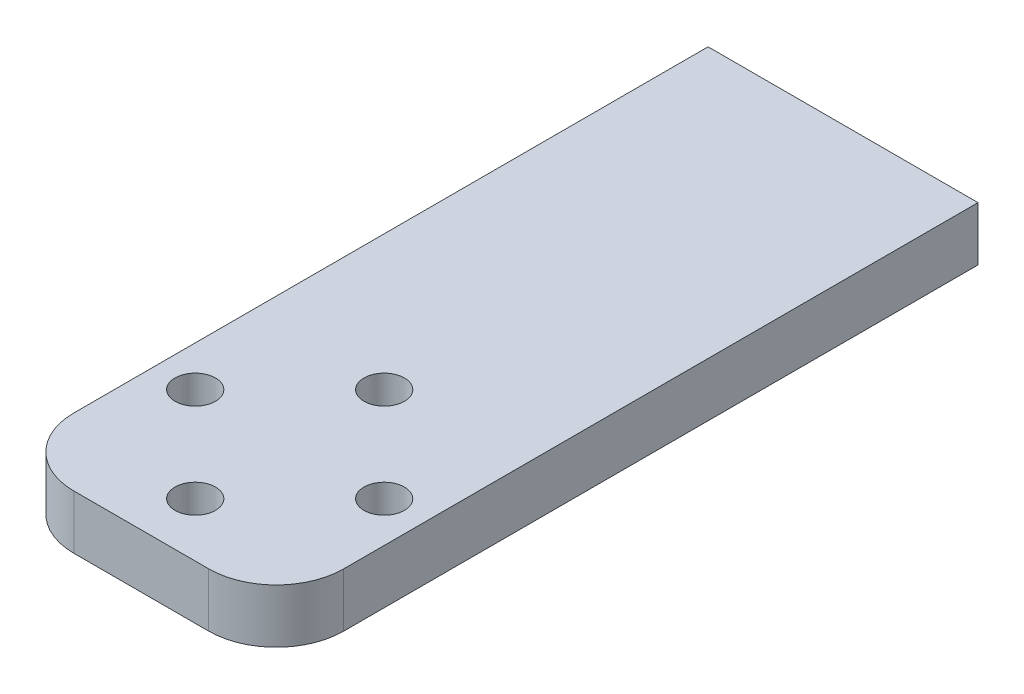
ISO-10303-21;
HEADER;
FILE_DESCRIPTION(('STEP AP214'),'2;1');
FILE_NAME('part.step','',(''),(''),'','','');
FILE_SCHEMA(('AUTOMOTIVE_DESIGN { 1 0 10303 214 1 1 1 1 }'));
ENDSEC;
DATA;
#1=APPLICATION_CONTEXT('core data for automotive mechanical design processes');
#2=APPLICATION_PROTOCOL_DEFINITION('international standard','automotive_design',2000,#1);
#3=PRODUCT_CONTEXT('',#1,'mechanical');
#4=PRODUCT('Part','Part','',(#3));
#5=PRODUCT_RELATED_PRODUCT_CATEGORY('part','',(#4));
#6=PRODUCT_DEFINITION_FORMATION('','',#4);
#7=PRODUCT_DEFINITION_CONTEXT('part definition',#1,'design');
#8=PRODUCT_DEFINITION('design','',#6,#7);
#9=PRODUCT_DEFINITION_SHAPE('','',#8);
#10=(LENGTH_UNIT() NAMED_UNIT(*) SI_UNIT(.MILLI.,.METRE.));
#11=(NAMED_UNIT(*) PLANE_ANGLE_UNIT() SI_UNIT($,.RADIAN.));
#12=(NAMED_UNIT(*) SI_UNIT($,.STERADIAN.) SOLID_ANGLE_UNIT());
#13=UNCERTAINTY_MEASURE_WITH_UNIT(LENGTH_MEASURE(1.E-05),#10,'distance_accuracy_value','');
#14=(GEOMETRIC_REPRESENTATION_CONTEXT(3) GLOBAL_UNCERTAINTY_ASSIGNED_CONTEXT((#13)) GLOBAL_UNIT_ASSIGNED_CONTEXT((#10,
#11,#12)) REPRESENTATION_CONTEXT('',''));
#15=CARTESIAN_POINT('',(0.,0.,0.));
#16=DIRECTION('',(0.,0.,1.));
#17=DIRECTION('',(1.,0.,0.));
#18=AXIS2_PLACEMENT_3D('',#15,#16,#17);
#19=CARTESIAN_POINT('',(0.,4.,0.));
#20=DIRECTION('',(0.,1.,0.));
#21=DIRECTION('',(0.,0.,1.));
#22=AXIS2_PLACEMENT_3D('',#19,#20,#21);
#23=PLANE('',#22);
#24=CARTESIAN_POINT('',(7.,4.,15.));
#25=DIRECTION('',(0.,1.,0.));
#26=DIRECTION('',(0.,0.,1.));
#27=AXIS2_PLACEMENT_3D('',#24,#25,#26);
#28=CIRCLE('',#27,1.5);
#29=CARTESIAN_POINT('',(7.,4.,16.5));
#30=VERTEX_POINT('',#29);
#31=EDGE_CURVE('E161',#30,#30,#28,.T.);
#32=ORIENTED_EDGE('',*,*,#31,.F.);
#33=EDGE_LOOP('',(#32));
#34=FACE_BOUND('',#33,.T.);
#35=CARTESIAN_POINT('',(0.,4.,22.));
#36=DIRECTION('',(0.,1.,0.));
#37=DIRECTION('',(0.,0.,1.));
#38=AXIS2_PLACEMENT_3D('',#35,#36,#37);
#39=CIRCLE('',#38,1.5);
#40=CARTESIAN_POINT('',(0.,4.,23.5));
#41=VERTEX_POINT('',#40);
#42=EDGE_CURVE('E152',#41,#41,#39,.T.);
#43=ORIENTED_EDGE('',*,*,#42,.F.);
#44=EDGE_LOOP('',(#43));
#45=FACE_BOUND('',#44,.T.);
#46=DIRECTION('',(0.,0.,1.));
#47=VECTOR('',#46,1.);
#48=CARTESIAN_POINT('',(-10.,4.,-26.));
#49=LINE('',#48,#47);
#50=CARTESIAN_POINT('',(-10.,4.,-26.));
#51=VERTEX_POINT('',#50);
#52=CARTESIAN_POINT('',(-10.,4.,21.));
#53=VERTEX_POINT('',#52);
#54=EDGE_CURVE('E108',#51,#53,#49,.T.);
#55=ORIENTED_EDGE('',*,*,#54,.T.);
#56=CARTESIAN_POINT('',(-5.,4.,21.));
#57=DIRECTION('',(0.,1.,0.));
#58=DIRECTION('',(0.,0.,1.));
#59=AXIS2_PLACEMENT_3D('',#56,#57,#58);
#60=CIRCLE('',#59,5.);
#61=CARTESIAN_POINT('',(-5.,4.,26.));
#62=VERTEX_POINT('',#61);
#63=EDGE_CURVE('E45',#53,#62,#60,.T.);
#64=ORIENTED_EDGE('',*,*,#63,.T.);
#65=DIRECTION('',(1.,0.,0.));
#66=VECTOR('',#65,1.);
#67=CARTESIAN_POINT('',(-10.,4.,26.));
#68=LINE('',#67,#66);
#69=CARTESIAN_POINT('',(5.,4.,26.));
#70=VERTEX_POINT('',#69);
#71=EDGE_CURVE('E118',#62,#70,#68,.T.);
#72=ORIENTED_EDGE('',*,*,#71,.T.);
#73=CARTESIAN_POINT('',(5.,4.,21.));
#74=DIRECTION('',(0.,1.,0.));
#75=DIRECTION('',(0.,0.,1.));
#76=AXIS2_PLACEMENT_3D('',#73,#74,#75);
#77=CIRCLE('',#76,5.);
#78=CARTESIAN_POINT('',(10.,4.,21.));
#79=VERTEX_POINT('',#78);
#80=EDGE_CURVE('E52',#70,#79,#77,.T.);
#81=ORIENTED_EDGE('',*,*,#80,.T.);
#82=DIRECTION('',(0.,0.,-1.));
#83=VECTOR('',#82,1.);
#84=CARTESIAN_POINT('',(9.99999999999999,4.,-26.));
#85=LINE('',#84,#83);
#86=CARTESIAN_POINT('',(9.99999999999999,4.,-26.));
#87=VERTEX_POINT('',#86);
#88=EDGE_CURVE('E90',#79,#87,#85,.T.);
#89=ORIENTED_EDGE('',*,*,#88,.T.);
#90=DIRECTION('',(-1.,0.,0.));
#91=VECTOR('',#90,1.);
#92=CARTESIAN_POINT('',(-10.,4.,-26.));
#93=LINE('',#92,#91);
#94=EDGE_CURVE('E93',#87,#51,#93,.T.);
#95=ORIENTED_EDGE('',*,*,#94,.T.);
#96=EDGE_LOOP('',(#55,#64,#72,#81,#89,#95));
#97=FACE_BOUND('',#96,.T.);
#98=CARTESIAN_POINT('',(0.,4.,7.99999999999999));
#99=DIRECTION('',(0.,1.,0.));
#100=DIRECTION('',(0.,0.,1.));
#101=AXIS2_PLACEMENT_3D('',#98,#99,#100);
#102=CIRCLE('',#101,1.5);
#103=CARTESIAN_POINT('',(0.,4.,9.49999999999999));
#104=VERTEX_POINT('',#103);
#105=EDGE_CURVE('E160',#104,#104,#102,.T.);
#106=ORIENTED_EDGE('',*,*,#105,.F.);
#107=EDGE_LOOP('',(#106));
#108=FACE_BOUND('',#107,.T.);
#109=CARTESIAN_POINT('',(-7.,4.,15.));
#110=DIRECTION('',(0.,1.,0.));
#111=DIRECTION('',(0.,0.,1.));
#112=AXIS2_PLACEMENT_3D('',#109,#110,#111);
#113=CIRCLE('',#112,1.5);
#114=CARTESIAN_POINT('',(-7.,4.,16.5));
#115=VERTEX_POINT('',#114);
#116=EDGE_CURVE('E168',#115,#115,#113,.T.);
#117=ORIENTED_EDGE('',*,*,#116,.F.);
#118=EDGE_LOOP('',(#117));
#119=FACE_BOUND('',#118,.T.);
#120=ADVANCED_FACE('F37',(#34,#45,#97,#108,#119),#23,.T.);
#121=CARTESIAN_POINT('',(0.,0.,0.));
#122=DIRECTION('',(0.,1.,0.));
#123=DIRECTION('',(0.,0.,1.));
#124=AXIS2_PLACEMENT_3D('',#121,#122,#123);
#125=PLANE('',#124);
#126=DIRECTION('',(1.,0.,0.));
#127=VECTOR('',#126,1.);
#128=CARTESIAN_POINT('',(-10.,0.,26.));
#129=LINE('',#128,#127);
#130=CARTESIAN_POINT('',(-5.,0.,26.));
#131=VERTEX_POINT('',#130);
#132=CARTESIAN_POINT('',(5.,0.,26.));
#133=VERTEX_POINT('',#132);
#134=EDGE_CURVE('E99',#131,#133,#129,.T.);
#135=ORIENTED_EDGE('',*,*,#134,.F.);
#136=CARTESIAN_POINT('',(-5.,0.,21.));
#137=DIRECTION('',(0.,1.,0.));
#138=DIRECTION('',(0.,0.,1.));
#139=AXIS2_PLACEMENT_3D('',#136,#137,#138);
#140=CIRCLE('',#139,5.);
#141=CARTESIAN_POINT('',(-10.,0.,21.));
#142=VERTEX_POINT('',#141);
#143=EDGE_CURVE('E126',#131,#142,#140,.F.);
#144=ORIENTED_EDGE('',*,*,#143,.T.);
#145=DIRECTION('',(0.,0.,1.));
#146=VECTOR('',#145,1.);
#147=CARTESIAN_POINT('',(-10.,0.,-26.));
#148=LINE('',#147,#146);
#149=CARTESIAN_POINT('',(-10.,0.,-26.));
#150=VERTEX_POINT('',#149);
#151=EDGE_CURVE('E230',#150,#142,#148,.T.);
#152=ORIENTED_EDGE('',*,*,#151,.F.);
#153=DIRECTION('',(-1.,0.,0.));
#154=VECTOR('',#153,1.);
#155=CARTESIAN_POINT('',(-10.,0.,-26.));
#156=LINE('',#155,#154);
#157=CARTESIAN_POINT('',(9.99999999999999,0.,-26.));
#158=VERTEX_POINT('',#157);
#159=EDGE_CURVE('E229',#158,#150,#156,.T.);
#160=ORIENTED_EDGE('',*,*,#159,.F.);
#161=DIRECTION('',(0.,0.,-1.));
#162=VECTOR('',#161,1.);
#163=CARTESIAN_POINT('',(9.99999999999999,0.,-26.));
#164=LINE('',#163,#162);
#165=CARTESIAN_POINT('',(10.,0.,21.));
#166=VERTEX_POINT('',#165);
#167=EDGE_CURVE('E112',#166,#158,#164,.T.);
#168=ORIENTED_EDGE('',*,*,#167,.F.);
#169=CARTESIAN_POINT('',(5.,0.,21.));
#170=DIRECTION('',(0.,1.,0.));
#171=DIRECTION('',(0.,0.,1.));
#172=AXIS2_PLACEMENT_3D('',#169,#170,#171);
#173=CIRCLE('',#172,5.);
#174=EDGE_CURVE('E124',#166,#133,#173,.F.);
#175=ORIENTED_EDGE('',*,*,#174,.T.);
#176=EDGE_LOOP('',(#135,#144,#152,#160,#168,#175));
#177=FACE_BOUND('',#176,.T.);
#178=CARTESIAN_POINT('',(0.,0.,22.));
#179=DIRECTION('',(0.,1.,0.));
#180=DIRECTION('',(0.,0.,1.));
#181=AXIS2_PLACEMENT_3D('',#178,#179,#180);
#182=CIRCLE('',#181,1.5);
#183=CARTESIAN_POINT('',(0.,0.,23.5));
#184=VERTEX_POINT('',#183);
#185=EDGE_CURVE('E140',#184,#184,#182,.T.);
#186=ORIENTED_EDGE('',*,*,#185,.T.);
#187=EDGE_LOOP('',(#186));
#188=FACE_BOUND('',#187,.T.);
#189=CARTESIAN_POINT('',(0.,0.,7.99999999999999));
#190=DIRECTION('',(0.,1.,0.));
#191=DIRECTION('',(0.,0.,1.));
#192=AXIS2_PLACEMENT_3D('',#189,#190,#191);
#193=CIRCLE('',#192,1.5);
#194=CARTESIAN_POINT('',(0.,0.,9.49999999999999));
#195=VERTEX_POINT('',#194);
#196=EDGE_CURVE('E157',#195,#195,#193,.T.);
#197=ORIENTED_EDGE('',*,*,#196,.T.);
#198=EDGE_LOOP('',(#197));
#199=FACE_BOUND('',#198,.T.);
#200=CARTESIAN_POINT('',(7.,0.,15.));
#201=DIRECTION('',(0.,1.,0.));
#202=DIRECTION('',(0.,0.,1.));
#203=AXIS2_PLACEMENT_3D('',#200,#201,#202);
#204=CIRCLE('',#203,1.5);
#205=CARTESIAN_POINT('',(7.,0.,16.5));
#206=VERTEX_POINT('',#205);
#207=EDGE_CURVE('E166',#206,#206,#204,.T.);
#208=ORIENTED_EDGE('',*,*,#207,.T.);
#209=EDGE_LOOP('',(#208));
#210=FACE_BOUND('',#209,.T.);
#211=CARTESIAN_POINT('',(-7.,0.,15.));
#212=DIRECTION('',(0.,1.,0.));
#213=DIRECTION('',(0.,0.,1.));
#214=AXIS2_PLACEMENT_3D('',#211,#212,#213);
#215=CIRCLE('',#214,1.5);
#216=CARTESIAN_POINT('',(-7.,0.,16.5));
#217=VERTEX_POINT('',#216);
#218=EDGE_CURVE('E173',#217,#217,#215,.T.);
#219=ORIENTED_EDGE('',*,*,#218,.T.);
#220=EDGE_LOOP('',(#219));
#221=FACE_BOUND('',#220,.T.);
#222=ADVANCED_FACE('F184',(#177,#188,#199,#210,#221),#125,.F.);
#223=CARTESIAN_POINT('',(9.99999999999999,4.,-26.));
#224=DIRECTION('',(-1.,0.,0.));
#225=DIRECTION('',(0.,0.,1.));
#226=AXIS2_PLACEMENT_3D('',#223,#224,#225);
#227=PLANE('',#226);
#228=ORIENTED_EDGE('',*,*,#88,.F.);
#229=DIRECTION('',(0.,-1.,0.));
#230=VECTOR('',#229,1.);
#231=CARTESIAN_POINT('',(10.,4.,21.));
#232=LINE('',#231,#230);
#233=EDGE_CURVE('E12',#79,#166,#232,.T.);
#234=ORIENTED_EDGE('',*,*,#233,.T.);
#235=ORIENTED_EDGE('',*,*,#167,.T.);
#236=DIRECTION('',(0.,-1.,0.));
#237=VECTOR('',#236,1.);
#238=CARTESIAN_POINT('',(9.99999999999999,4.,-26.));
#239=LINE('',#238,#237);
#240=EDGE_CURVE('E104',#87,#158,#239,.T.);
#241=ORIENTED_EDGE('',*,*,#240,.F.);
#242=EDGE_LOOP('',(#228,#234,#235,#241));
#243=FACE_BOUND('',#242,.T.);
#244=ADVANCED_FACE('F110',(#243),#227,.F.);
#245=CARTESIAN_POINT('',(-10.,4.,-26.));
#246=DIRECTION('',(0.,0.,1.));
#247=DIRECTION('',(1.,0.,0.));
#248=AXIS2_PLACEMENT_3D('',#245,#246,#247);
#249=PLANE('',#248);
#250=ORIENTED_EDGE('',*,*,#159,.T.);
#251=DIRECTION('',(0.,-1.,0.));
#252=VECTOR('',#251,1.);
#253=CARTESIAN_POINT('',(-10.,4.,-26.));
#254=LINE('',#253,#252);
#255=EDGE_CURVE('E106',#51,#150,#254,.T.);
#256=ORIENTED_EDGE('',*,*,#255,.F.);
#257=ORIENTED_EDGE('',*,*,#94,.F.);
#258=ORIENTED_EDGE('',*,*,#240,.T.);
#259=EDGE_LOOP('',(#250,#256,#257,#258));
#260=FACE_BOUND('',#259,.T.);
#261=ADVANCED_FACE('F103',(#260),#249,.F.);
#262=CARTESIAN_POINT('',(-10.,4.,-26.));
#263=DIRECTION('',(1.,0.,0.));
#264=DIRECTION('',(0.,0.,-1.));
#265=AXIS2_PLACEMENT_3D('',#262,#263,#264);
#266=PLANE('',#265);
#267=ORIENTED_EDGE('',*,*,#151,.T.);
#268=DIRECTION('',(0.,-1.,0.));
#269=VECTOR('',#268,1.);
#270=CARTESIAN_POINT('',(-10.,4.,21.));
#271=LINE('',#270,#269);
#272=EDGE_CURVE('E60',#142,#53,#271,.F.);
#273=ORIENTED_EDGE('',*,*,#272,.T.);
#274=ORIENTED_EDGE('',*,*,#54,.F.);
#275=ORIENTED_EDGE('',*,*,#255,.T.);
#276=EDGE_LOOP('',(#267,#273,#274,#275));
#277=FACE_BOUND('',#276,.T.);
#278=ADVANCED_FACE('F202',(#277),#266,.F.);
#279=CARTESIAN_POINT('',(-10.,4.,26.));
#280=DIRECTION('',(0.,0.,-1.));
#281=DIRECTION('',(-1.,0.,0.));
#282=AXIS2_PLACEMENT_3D('',#279,#280,#281);
#283=PLANE('',#282);
#284=ORIENTED_EDGE('',*,*,#71,.F.);
#285=DIRECTION('',(0.,-1.,0.));
#286=VECTOR('',#285,1.);
#287=CARTESIAN_POINT('',(-5.,4.,26.));
#288=LINE('',#287,#286);
#289=EDGE_CURVE('E116',#62,#131,#288,.T.);
#290=ORIENTED_EDGE('',*,*,#289,.T.);
#291=ORIENTED_EDGE('',*,*,#134,.T.);
#292=DIRECTION('',(0.,-1.,0.));
#293=VECTOR('',#292,1.);
#294=CARTESIAN_POINT('',(5.,4.,26.));
#295=LINE('',#294,#293);
#296=EDGE_CURVE('E114',#133,#70,#295,.F.);
#297=ORIENTED_EDGE('',*,*,#296,.T.);
#298=EDGE_LOOP('',(#284,#290,#291,#297));
#299=FACE_BOUND('',#298,.T.);
#300=ADVANCED_FACE('F199',(#299),#283,.F.);
#301=CARTESIAN_POINT('',(0.,4.,22.));
#302=DIRECTION('',(0.,-1.,0.));
#303=DIRECTION('',(0.,0.,-1.));
#304=AXIS2_PLACEMENT_3D('',#301,#302,#303);
#305=CYLINDRICAL_SURFACE('',#304,1.5);
#306=ORIENTED_EDGE('',*,*,#42,.T.);
#307=EDGE_LOOP('',(#306));
#308=FACE_BOUND('',#307,.T.);
#309=ORIENTED_EDGE('',*,*,#185,.F.);
#310=EDGE_LOOP('',(#309));
#311=FACE_BOUND('',#310,.T.);
#312=ADVANCED_FACE('F196',(#308,#311),#305,.F.);
#313=CARTESIAN_POINT('',(0.,4.,7.99999999999999));
#314=DIRECTION('',(0.,-1.,0.));
#315=DIRECTION('',(0.,0.,-1.));
#316=AXIS2_PLACEMENT_3D('',#313,#314,#315);
#317=CYLINDRICAL_SURFACE('',#316,1.5);
#318=ORIENTED_EDGE('',*,*,#105,.T.);
#319=EDGE_LOOP('',(#318));
#320=FACE_BOUND('',#319,.T.);
#321=ORIENTED_EDGE('',*,*,#196,.F.);
#322=EDGE_LOOP('',(#321));
#323=FACE_BOUND('',#322,.T.);
#324=ADVANCED_FACE('F243',(#320,#323),#317,.F.);
#325=CARTESIAN_POINT('',(7.,4.,15.));
#326=DIRECTION('',(0.,-1.,0.));
#327=DIRECTION('',(0.,0.,-1.));
#328=AXIS2_PLACEMENT_3D('',#325,#326,#327);
#329=CYLINDRICAL_SURFACE('',#328,1.5);
#330=ORIENTED_EDGE('',*,*,#31,.T.);
#331=EDGE_LOOP('',(#330));
#332=FACE_BOUND('',#331,.T.);
#333=ORIENTED_EDGE('',*,*,#207,.F.);
#334=EDGE_LOOP('',(#333));
#335=FACE_BOUND('',#334,.T.);
#336=ADVANCED_FACE('F217',(#332,#335),#329,.F.);
#337=CARTESIAN_POINT('',(-7.,4.,15.));
#338=DIRECTION('',(0.,-1.,0.));
#339=DIRECTION('',(0.,0.,-1.));
#340=AXIS2_PLACEMENT_3D('',#337,#338,#339);
#341=CYLINDRICAL_SURFACE('',#340,1.5);
#342=ORIENTED_EDGE('',*,*,#116,.T.);
#343=EDGE_LOOP('',(#342));
#344=FACE_BOUND('',#343,.T.);
#345=ORIENTED_EDGE('',*,*,#218,.F.);
#346=EDGE_LOOP('',(#345));
#347=FACE_BOUND('',#346,.T.);
#348=ADVANCED_FACE('F180',(#344,#347),#341,.F.);
#349=CARTESIAN_POINT('',(-5.,4.,21.));
#350=DIRECTION('',(0.,-1.,0.));
#351=DIRECTION('',(0.,0.,-1.));
#352=AXIS2_PLACEMENT_3D('',#349,#350,#351);
#353=CYLINDRICAL_SURFACE('',#352,5.);
#354=ORIENTED_EDGE('',*,*,#63,.F.);
#355=ORIENTED_EDGE('',*,*,#272,.F.);
#356=ORIENTED_EDGE('',*,*,#143,.F.);
#357=ORIENTED_EDGE('',*,*,#289,.F.);
#358=EDGE_LOOP('',(#354,#355,#356,#357));
#359=FACE_BOUND('',#358,.T.);
#360=ADVANCED_FACE('F209',(#359),#353,.T.);
#361=CARTESIAN_POINT('',(5.,4.,21.));
#362=DIRECTION('',(0.,-1.,0.));
#363=DIRECTION('',(0.,0.,-1.));
#364=AXIS2_PLACEMENT_3D('',#361,#362,#363);
#365=CYLINDRICAL_SURFACE('',#364,5.);
#366=ORIENTED_EDGE('',*,*,#80,.F.);
#367=ORIENTED_EDGE('',*,*,#296,.F.);
#368=ORIENTED_EDGE('',*,*,#174,.F.);
#369=ORIENTED_EDGE('',*,*,#233,.F.);
#370=EDGE_LOOP('',(#366,#367,#368,#369));
#371=FACE_BOUND('',#370,.T.);
#372=ADVANCED_FACE('F39',(#371),#365,.T.);
#373=CLOSED_SHELL('',(#120,#222,#244,#261,#278,#300,#312,#324,#336,#348,#360,#372));
#374=MANIFOLD_SOLID_BREP('B2',#373);
#375=ADVANCED_BREP_SHAPE_REPRESENTATION('',(#18,#374),#14);
#376=SHAPE_DEFINITION_REPRESENTATION(#9,#375);
ENDSEC;
END-ISO-10303-21;
